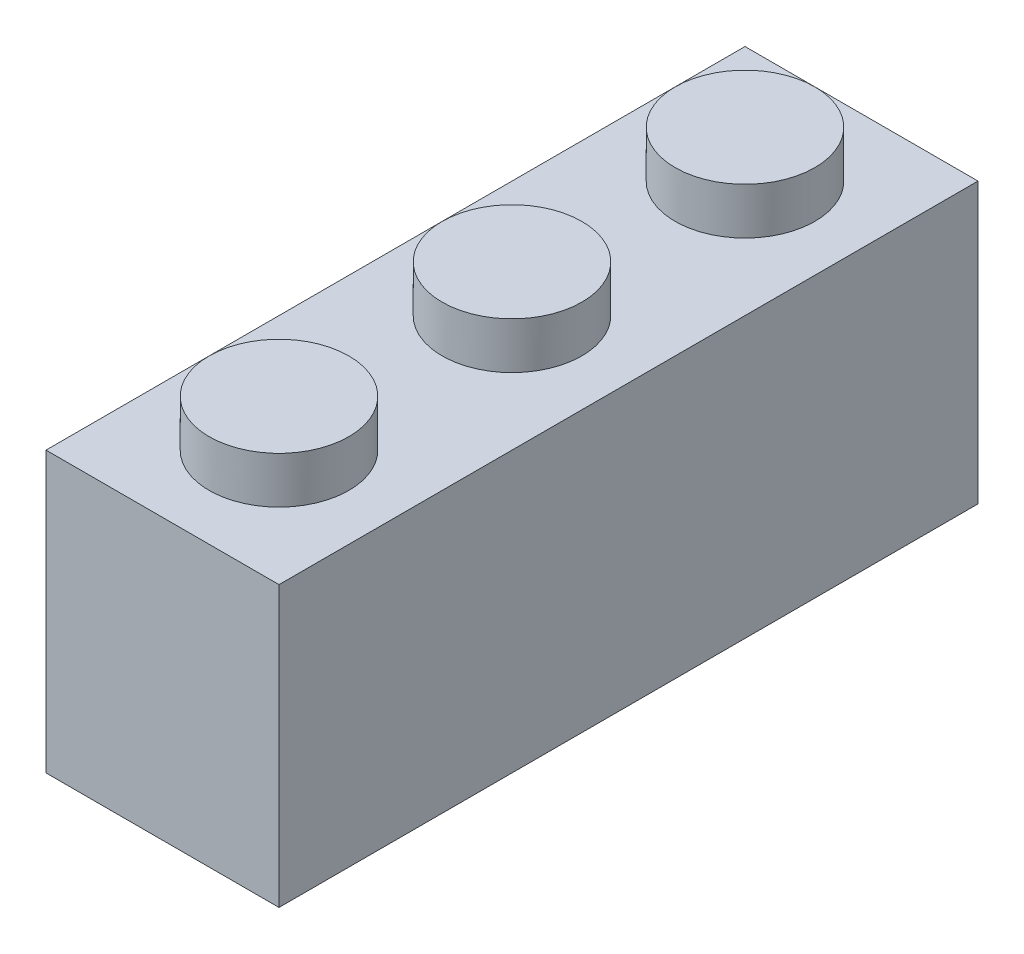
ISO-10303-21;
HEADER;
FILE_DESCRIPTION(('STEP AP214'),'2;1');
FILE_NAME('part.step','',(''),(''),'','','');
FILE_SCHEMA(('AUTOMOTIVE_DESIGN { 1 0 10303 214 1 1 1 1 }'));
ENDSEC;
DATA;
#1=APPLICATION_CONTEXT('core data for automotive mechanical design processes');
#2=APPLICATION_PROTOCOL_DEFINITION('international standard','automotive_design',2000,#1);
#3=PRODUCT_CONTEXT('',#1,'mechanical');
#4=PRODUCT('Part','Part','',(#3));
#5=PRODUCT_RELATED_PRODUCT_CATEGORY('part','',(#4));
#6=PRODUCT_DEFINITION_FORMATION('','',#4);
#7=PRODUCT_DEFINITION_CONTEXT('part definition',#1,'design');
#8=PRODUCT_DEFINITION('design','',#6,#7);
#9=PRODUCT_DEFINITION_SHAPE('','',#8);
#10=(LENGTH_UNIT() NAMED_UNIT(*) SI_UNIT(.MILLI.,.METRE.));
#11=(NAMED_UNIT(*) PLANE_ANGLE_UNIT() SI_UNIT($,.RADIAN.));
#12=(NAMED_UNIT(*) SI_UNIT($,.STERADIAN.) SOLID_ANGLE_UNIT());
#13=UNCERTAINTY_MEASURE_WITH_UNIT(LENGTH_MEASURE(1.E-05),#10,'distance_accuracy_value','');
#14=(GEOMETRIC_REPRESENTATION_CONTEXT(3) GLOBAL_UNCERTAINTY_ASSIGNED_CONTEXT((#13)) GLOBAL_UNIT_ASSIGNED_CONTEXT((#10,
#11,#12)) REPRESENTATION_CONTEXT('',''));
#15=CARTESIAN_POINT('',(0.,0.,0.));
#16=DIRECTION('',(0.,0.,1.));
#17=DIRECTION('',(1.,0.,0.));
#18=AXIS2_PLACEMENT_3D('',#15,#16,#17);
#19=CARTESIAN_POINT('',(0.,0.,0.));
#20=DIRECTION('',(0.,-1.,0.));
#21=DIRECTION('',(0.,0.,-1.));
#22=AXIS2_PLACEMENT_3D('',#19,#20,#21);
#23=PLANE('',#22);
#24=DIRECTION('',(0.,0.,1.));
#25=VECTOR('',#24,1.);
#26=CARTESIAN_POINT('',(0.,0.,0.));
#27=LINE('',#26,#25);
#28=CARTESIAN_POINT('',(0.,0.,-24.));
#29=VERTEX_POINT('',#28);
#30=CARTESIAN_POINT('',(0.,0.,0.));
#31=VERTEX_POINT('',#30);
#32=EDGE_CURVE('E182',#29,#31,#27,.T.);
#33=ORIENTED_EDGE('',*,*,#32,.F.);
#34=DIRECTION('',(-1.,0.,0.));
#35=VECTOR('',#34,1.);
#36=CARTESIAN_POINT('',(0.,0.,-24.));
#37=LINE('',#36,#35);
#38=CARTESIAN_POINT('',(8.,0.,-24.));
#39=VERTEX_POINT('',#38);
#40=EDGE_CURVE('E85',#39,#29,#37,.T.);
#41=ORIENTED_EDGE('',*,*,#40,.F.);
#42=DIRECTION('',(0.,0.,-1.));
#43=VECTOR('',#42,1.);
#44=CARTESIAN_POINT('',(8.,0.,0.));
#45=LINE('',#44,#43);
#46=CARTESIAN_POINT('',(8.,0.,0.));
#47=VERTEX_POINT('',#46);
#48=EDGE_CURVE('E200',#47,#39,#45,.T.);
#49=ORIENTED_EDGE('',*,*,#48,.F.);
#50=DIRECTION('',(1.,0.,0.));
#51=VECTOR('',#50,1.);
#52=CARTESIAN_POINT('',(0.,0.,0.));
#53=LINE('',#52,#51);
#54=EDGE_CURVE('E197',#31,#47,#53,.T.);
#55=ORIENTED_EDGE('',*,*,#54,.F.);
#56=EDGE_LOOP('',(#33,#41,#49,#55));
#57=FACE_BOUND('',#56,.T.);
#58=DIRECTION('',(-1.,0.,0.));
#59=VECTOR('',#58,1.);
#60=CARTESIAN_POINT('',(0.,0.,-22.4));
#61=LINE('',#60,#59);
#62=CARTESIAN_POINT('',(6.4,0.,-22.4));
#63=VERTEX_POINT('',#62);
#64=CARTESIAN_POINT('',(1.6,0.,-22.4));
#65=VERTEX_POINT('',#64);
#66=EDGE_CURVE('E165',#63,#65,#61,.T.);
#67=ORIENTED_EDGE('',*,*,#66,.T.);
#68=DIRECTION('',(0.,0.,1.));
#69=VECTOR('',#68,1.);
#70=CARTESIAN_POINT('',(1.6,0.,0.));
#71=LINE('',#70,#69);
#72=CARTESIAN_POINT('',(1.6,0.,-1.6));
#73=VERTEX_POINT('',#72);
#74=EDGE_CURVE('E156',#65,#73,#71,.T.);
#75=ORIENTED_EDGE('',*,*,#74,.T.);
#76=DIRECTION('',(1.,0.,0.));
#77=VECTOR('',#76,1.);
#78=CARTESIAN_POINT('',(0.,0.,-1.6));
#79=LINE('',#78,#77);
#80=CARTESIAN_POINT('',(6.4,0.,-1.6));
#81=VERTEX_POINT('',#80);
#82=EDGE_CURVE('E164',#73,#81,#79,.T.);
#83=ORIENTED_EDGE('',*,*,#82,.T.);
#84=DIRECTION('',(0.,0.,-1.));
#85=VECTOR('',#84,1.);
#86=CARTESIAN_POINT('',(6.4,0.,0.));
#87=LINE('',#86,#85);
#88=EDGE_CURVE('E55',#81,#63,#87,.T.);
#89=ORIENTED_EDGE('',*,*,#88,.T.);
#90=EDGE_LOOP('',(#67,#75,#83,#89));
#91=FACE_BOUND('',#90,.T.);
#92=ADVANCED_FACE('F39',(#57,#91),#23,.T.);
#93=CARTESIAN_POINT('',(4.,11.2,-20.));
#94=DIRECTION('',(0.,1.,0.));
#95=DIRECTION('',(0.,0.,1.));
#96=AXIS2_PLACEMENT_3D('',#93,#94,#95);
#97=PLANE('',#96);
#98=CARTESIAN_POINT('',(4.,11.2,-20.));
#99=DIRECTION('',(0.,1.,0.));
#100=DIRECTION('',(0.,0.,1.));
#101=AXIS2_PLACEMENT_3D('',#98,#99,#100);
#102=CIRCLE('',#101,2.4);
#103=CARTESIAN_POINT('',(4.,11.2,-17.6));
#104=VERTEX_POINT('',#103);
#105=EDGE_CURVE('E11',#104,#104,#102,.T.);
#106=ORIENTED_EDGE('',*,*,#105,.T.);
#107=EDGE_LOOP('',(#106));
#108=FACE_BOUND('',#107,.T.);
#109=ADVANCED_FACE('F41',(#108),#97,.T.);
#110=CARTESIAN_POINT('',(4.,11.2,-20.));
#111=DIRECTION('',(0.,-1.,0.));
#112=DIRECTION('',(0.,0.,-1.));
#113=AXIS2_PLACEMENT_3D('',#110,#111,#112);
#114=CYLINDRICAL_SURFACE('',#113,2.4);
#115=ORIENTED_EDGE('',*,*,#105,.F.);
#116=EDGE_LOOP('',(#115));
#117=FACE_BOUND('',#116,.T.);
#118=CARTESIAN_POINT('',(4.,9.6,-20.));
#119=DIRECTION('',(0.,-1.,0.));
#120=DIRECTION('',(0.,0.,-1.));
#121=AXIS2_PLACEMENT_3D('',#118,#119,#120);
#122=CIRCLE('',#121,2.4);
#123=CARTESIAN_POINT('',(4.,9.6,-22.4));
#124=VERTEX_POINT('',#123);
#125=EDGE_CURVE('E48',#124,#124,#122,.F.);
#126=ORIENTED_EDGE('',*,*,#125,.T.);
#127=EDGE_LOOP('',(#126));
#128=FACE_BOUND('',#127,.T.);
#129=ADVANCED_FACE('F228',(#117,#128),#114,.T.);
#130=CARTESIAN_POINT('',(0.,9.6,0.));
#131=DIRECTION('',(1.,0.,0.));
#132=DIRECTION('',(0.,0.,-1.));
#133=AXIS2_PLACEMENT_3D('',#130,#131,#132);
#134=PLANE('',#133);
#135=ORIENTED_EDGE('',*,*,#32,.T.);
#136=DIRECTION('',(0.,-1.,0.));
#137=VECTOR('',#136,1.);
#138=CARTESIAN_POINT('',(0.,9.6,0.));
#139=LINE('',#138,#137);
#140=CARTESIAN_POINT('',(0.,9.6,0.));
#141=VERTEX_POINT('',#140);
#142=EDGE_CURVE('E214',#141,#31,#139,.T.);
#143=ORIENTED_EDGE('',*,*,#142,.F.);
#144=DIRECTION('',(0.,0.,1.));
#145=VECTOR('',#144,1.);
#146=CARTESIAN_POINT('',(0.,9.6,0.));
#147=LINE('',#146,#145);
#148=CARTESIAN_POINT('',(0.,9.6,-24.));
#149=VERTEX_POINT('',#148);
#150=EDGE_CURVE('E183',#149,#141,#147,.T.);
#151=ORIENTED_EDGE('',*,*,#150,.F.);
#152=DIRECTION('',(0.,-1.,0.));
#153=VECTOR('',#152,1.);
#154=CARTESIAN_POINT('',(0.,9.6,-24.));
#155=LINE('',#154,#153);
#156=EDGE_CURVE('E193',#149,#29,#155,.T.);
#157=ORIENTED_EDGE('',*,*,#156,.T.);
#158=EDGE_LOOP('',(#135,#143,#151,#157));
#159=FACE_BOUND('',#158,.T.);
#160=ADVANCED_FACE('F263',(#159),#134,.F.);
#161=CARTESIAN_POINT('',(0.,9.6,0.));
#162=DIRECTION('',(0.,0.,-1.));
#163=DIRECTION('',(-1.,0.,0.));
#164=AXIS2_PLACEMENT_3D('',#161,#162,#163);
#165=PLANE('',#164);
#166=ORIENTED_EDGE('',*,*,#54,.T.);
#167=DIRECTION('',(0.,-1.,0.));
#168=VECTOR('',#167,1.);
#169=CARTESIAN_POINT('',(8.,9.6,0.));
#170=LINE('',#169,#168);
#171=CARTESIAN_POINT('',(8.,9.6,0.));
#172=VERTEX_POINT('',#171);
#173=EDGE_CURVE('E210',#172,#47,#170,.T.);
#174=ORIENTED_EDGE('',*,*,#173,.F.);
#175=DIRECTION('',(1.,0.,0.));
#176=VECTOR('',#175,1.);
#177=CARTESIAN_POINT('',(0.,9.6,0.));
#178=LINE('',#177,#176);
#179=EDGE_CURVE('E93',#141,#172,#178,.T.);
#180=ORIENTED_EDGE('',*,*,#179,.F.);
#181=ORIENTED_EDGE('',*,*,#142,.T.);
#182=EDGE_LOOP('',(#166,#174,#180,#181));
#183=FACE_BOUND('',#182,.T.);
#184=ADVANCED_FACE('F259',(#183),#165,.F.);
#185=CARTESIAN_POINT('',(8.,9.6,0.));
#186=DIRECTION('',(-1.,0.,0.));
#187=DIRECTION('',(0.,0.,1.));
#188=AXIS2_PLACEMENT_3D('',#185,#186,#187);
#189=PLANE('',#188);
#190=ORIENTED_EDGE('',*,*,#48,.T.);
#191=DIRECTION('',(0.,-1.,0.));
#192=VECTOR('',#191,1.);
#193=CARTESIAN_POINT('',(8.,9.6,-24.));
#194=LINE('',#193,#192);
#195=CARTESIAN_POINT('',(8.,9.6,-24.));
#196=VERTEX_POINT('',#195);
#197=EDGE_CURVE('E207',#196,#39,#194,.T.);
#198=ORIENTED_EDGE('',*,*,#197,.F.);
#199=DIRECTION('',(0.,0.,-1.));
#200=VECTOR('',#199,1.);
#201=CARTESIAN_POINT('',(8.,9.6,0.));
#202=LINE('',#201,#200);
#203=EDGE_CURVE('E188',#172,#196,#202,.T.);
#204=ORIENTED_EDGE('',*,*,#203,.F.);
#205=ORIENTED_EDGE('',*,*,#173,.T.);
#206=EDGE_LOOP('',(#190,#198,#204,#205));
#207=FACE_BOUND('',#206,.T.);
#208=ADVANCED_FACE('F243',(#207),#189,.F.);
#209=CARTESIAN_POINT('',(0.,9.6,-24.));
#210=DIRECTION('',(0.,0.,1.));
#211=DIRECTION('',(1.,0.,0.));
#212=AXIS2_PLACEMENT_3D('',#209,#210,#211);
#213=PLANE('',#212);
#214=ORIENTED_EDGE('',*,*,#40,.T.);
#215=ORIENTED_EDGE('',*,*,#156,.F.);
#216=DIRECTION('',(-1.,0.,0.));
#217=VECTOR('',#216,1.);
#218=CARTESIAN_POINT('',(0.,9.6,-24.));
#219=LINE('',#218,#217);
#220=EDGE_CURVE('E64',#196,#149,#219,.T.);
#221=ORIENTED_EDGE('',*,*,#220,.F.);
#222=ORIENTED_EDGE('',*,*,#197,.T.);
#223=EDGE_LOOP('',(#214,#215,#221,#222));
#224=FACE_BOUND('',#223,.T.);
#225=ADVANCED_FACE('F233',(#224),#213,.F.);
#226=CARTESIAN_POINT('',(0.,9.6,0.));
#227=DIRECTION('',(0.,-1.,0.));
#228=DIRECTION('',(0.,0.,-1.));
#229=AXIS2_PLACEMENT_3D('',#226,#227,#228);
#230=PLANE('',#229);
#231=CARTESIAN_POINT('',(4.,9.6,-12.));
#232=DIRECTION('',(0.,-1.,0.));
#233=DIRECTION('',(0.,0.,-1.));
#234=AXIS2_PLACEMENT_3D('',#231,#232,#233);
#235=CIRCLE('',#234,2.4);
#236=CARTESIAN_POINT('',(4.,9.6,-14.4));
#237=VERTEX_POINT('',#236);
#238=EDGE_CURVE('E221',#237,#237,#235,.F.);
#239=ORIENTED_EDGE('',*,*,#238,.F.);
#240=EDGE_LOOP('',(#239));
#241=FACE_BOUND('',#240,.T.);
#242=CARTESIAN_POINT('',(4.,9.6,-4.));
#243=DIRECTION('',(0.,-1.,0.));
#244=DIRECTION('',(0.,0.,-1.));
#245=AXIS2_PLACEMENT_3D('',#242,#243,#244);
#246=CIRCLE('',#245,2.4);
#247=CARTESIAN_POINT('',(4.,9.6,-6.4));
#248=VERTEX_POINT('',#247);
#249=EDGE_CURVE('E217',#248,#248,#246,.F.);
#250=ORIENTED_EDGE('',*,*,#249,.F.);
#251=EDGE_LOOP('',(#250));
#252=FACE_BOUND('',#251,.T.);
#253=ORIENTED_EDGE('',*,*,#150,.T.);
#254=ORIENTED_EDGE('',*,*,#179,.T.);
#255=ORIENTED_EDGE('',*,*,#203,.T.);
#256=ORIENTED_EDGE('',*,*,#220,.T.);
#257=EDGE_LOOP('',(#253,#254,#255,#256));
#258=FACE_BOUND('',#257,.T.);
#259=ORIENTED_EDGE('',*,*,#125,.F.);
#260=EDGE_LOOP('',(#259));
#261=FACE_BOUND('',#260,.T.);
#262=ADVANCED_FACE('F230',(#241,#252,#258,#261),#230,.F.);
#263=CARTESIAN_POINT('',(4.,11.2,-4.));
#264=DIRECTION('',(0.,-1.,0.));
#265=DIRECTION('',(0.,0.,-1.));
#266=AXIS2_PLACEMENT_3D('',#263,#264,#265);
#267=CYLINDRICAL_SURFACE('',#266,2.4);
#268=CARTESIAN_POINT('',(4.,11.2,-4.));
#269=DIRECTION('',(0.,1.,0.));
#270=DIRECTION('',(0.,0.,1.));
#271=AXIS2_PLACEMENT_3D('',#268,#269,#270);
#272=CIRCLE('',#271,2.4);
#273=CARTESIAN_POINT('',(4.,11.2,-1.6));
#274=VERTEX_POINT('',#273);
#275=EDGE_CURVE('E177',#274,#274,#272,.T.);
#276=ORIENTED_EDGE('',*,*,#275,.F.);
#277=EDGE_LOOP('',(#276));
#278=FACE_BOUND('',#277,.T.);
#279=ORIENTED_EDGE('',*,*,#249,.T.);
#280=EDGE_LOOP('',(#279));
#281=FACE_BOUND('',#280,.T.);
#282=ADVANCED_FACE('F232',(#278,#281),#267,.T.);
#283=CARTESIAN_POINT('',(4.,11.2,-4.));
#284=DIRECTION('',(0.,1.,0.));
#285=DIRECTION('',(0.,0.,1.));
#286=AXIS2_PLACEMENT_3D('',#283,#284,#285);
#287=PLANE('',#286);
#288=ORIENTED_EDGE('',*,*,#275,.T.);
#289=EDGE_LOOP('',(#288));
#290=FACE_BOUND('',#289,.T.);
#291=ADVANCED_FACE('F240',(#290),#287,.T.);
#292=CARTESIAN_POINT('',(4.,11.2,-12.));
#293=DIRECTION('',(0.,-1.,0.));
#294=DIRECTION('',(0.,0.,-1.));
#295=AXIS2_PLACEMENT_3D('',#292,#293,#294);
#296=CYLINDRICAL_SURFACE('',#295,2.4);
#297=CARTESIAN_POINT('',(4.,11.2,-12.));
#298=DIRECTION('',(0.,1.,0.));
#299=DIRECTION('',(0.,0.,1.));
#300=AXIS2_PLACEMENT_3D('',#297,#298,#299);
#301=CIRCLE('',#300,2.4);
#302=CARTESIAN_POINT('',(4.,11.2,-9.6));
#303=VERTEX_POINT('',#302);
#304=EDGE_CURVE('E173',#303,#303,#301,.T.);
#305=ORIENTED_EDGE('',*,*,#304,.F.);
#306=EDGE_LOOP('',(#305));
#307=FACE_BOUND('',#306,.T.);
#308=ORIENTED_EDGE('',*,*,#238,.T.);
#309=EDGE_LOOP('',(#308));
#310=FACE_BOUND('',#309,.T.);
#311=ADVANCED_FACE('F304',(#307,#310),#296,.T.);
#312=CARTESIAN_POINT('',(4.,11.2,-12.));
#313=DIRECTION('',(0.,1.,0.));
#314=DIRECTION('',(0.,0.,1.));
#315=AXIS2_PLACEMENT_3D('',#312,#313,#314);
#316=PLANE('',#315);
#317=ORIENTED_EDGE('',*,*,#304,.T.);
#318=EDGE_LOOP('',(#317));
#319=FACE_BOUND('',#318,.T.);
#320=ADVANCED_FACE('F322',(#319),#316,.T.);
#321=CARTESIAN_POINT('',(4.,9.6,-20.));
#322=DIRECTION('',(0.,1.,0.));
#323=DIRECTION('',(0.,0.,1.));
#324=AXIS2_PLACEMENT_3D('',#321,#322,#323);
#325=PLANE('',#324);
#326=CARTESIAN_POINT('',(4.,9.6,-20.));
#327=DIRECTION('',(0.,1.,0.));
#328=DIRECTION('',(0.,0.,1.));
#329=AXIS2_PLACEMENT_3D('',#326,#327,#328);
#330=CIRCLE('',#329,0.799999999999999);
#331=CARTESIAN_POINT('',(4.,9.6,-19.2));
#332=VERTEX_POINT('',#331);
#333=EDGE_CURVE('E178',#332,#332,#330,.T.);
#334=ORIENTED_EDGE('',*,*,#333,.F.);
#335=EDGE_LOOP('',(#334));
#336=FACE_BOUND('',#335,.T.);
#337=ADVANCED_FACE('F331',(#336),#325,.F.);
#338=CARTESIAN_POINT('',(4.,11.2,-20.));
#339=DIRECTION('',(0.,-1.,0.));
#340=DIRECTION('',(0.,0.,-1.));
#341=AXIS2_PLACEMENT_3D('',#338,#339,#340);
#342=CYLINDRICAL_SURFACE('',#341,0.799999999999999);
#343=ORIENTED_EDGE('',*,*,#333,.T.);
#344=EDGE_LOOP('',(#343));
#345=FACE_BOUND('',#344,.T.);
#346=CARTESIAN_POINT('',(4.,8.,-20.));
#347=DIRECTION('',(0.,-1.,0.));
#348=DIRECTION('',(0.,0.,-1.));
#349=AXIS2_PLACEMENT_3D('',#346,#347,#348);
#350=CIRCLE('',#349,0.799999999999999);
#351=CARTESIAN_POINT('',(4.,8.,-20.8));
#352=VERTEX_POINT('',#351);
#353=EDGE_CURVE('E450',#352,#352,#350,.F.);
#354=ORIENTED_EDGE('',*,*,#353,.F.);
#355=EDGE_LOOP('',(#354));
#356=FACE_BOUND('',#355,.T.);
#357=ADVANCED_FACE('F344',(#345,#356),#342,.F.);
#358=CARTESIAN_POINT('',(1.6,9.6,0.));
#359=DIRECTION('',(1.,0.,0.));
#360=DIRECTION('',(0.,0.,-1.));
#361=AXIS2_PLACEMENT_3D('',#358,#359,#360);
#362=PLANE('',#361);
#363=ORIENTED_EDGE('',*,*,#74,.F.);
#364=DIRECTION('',(0.,-1.,0.));
#365=VECTOR('',#364,1.);
#366=CARTESIAN_POINT('',(1.6,9.6,-22.4));
#367=LINE('',#366,#365);
#368=CARTESIAN_POINT('',(1.6,8.,-22.4));
#369=VERTEX_POINT('',#368);
#370=EDGE_CURVE('E141',#369,#65,#367,.T.);
#371=ORIENTED_EDGE('',*,*,#370,.F.);
#372=DIRECTION('',(0.,0.,1.));
#373=VECTOR('',#372,1.);
#374=CARTESIAN_POINT('',(1.6,8.,0.));
#375=LINE('',#374,#373);
#376=CARTESIAN_POINT('',(1.6,8.,-1.6));
#377=VERTEX_POINT('',#376);
#378=EDGE_CURVE('E127',#369,#377,#375,.T.);
#379=ORIENTED_EDGE('',*,*,#378,.T.);
#380=DIRECTION('',(0.,-1.,0.));
#381=VECTOR('',#380,1.);
#382=CARTESIAN_POINT('',(1.6,9.6,-1.6));
#383=LINE('',#382,#381);
#384=EDGE_CURVE('E120',#377,#73,#383,.T.);
#385=ORIENTED_EDGE('',*,*,#384,.T.);
#386=EDGE_LOOP('',(#363,#371,#379,#385));
#387=FACE_BOUND('',#386,.T.);
#388=ADVANCED_FACE('F353',(#387),#362,.T.);
#389=CARTESIAN_POINT('',(0.,9.6,-1.6));
#390=DIRECTION('',(0.,0.,-1.));
#391=DIRECTION('',(-1.,0.,0.));
#392=AXIS2_PLACEMENT_3D('',#389,#390,#391);
#393=PLANE('',#392);
#394=ORIENTED_EDGE('',*,*,#82,.F.);
#395=ORIENTED_EDGE('',*,*,#384,.F.);
#396=DIRECTION('',(1.,0.,0.));
#397=VECTOR('',#396,1.);
#398=CARTESIAN_POINT('',(0.,8.,-1.6));
#399=LINE('',#398,#397);
#400=CARTESIAN_POINT('',(6.4,8.,-1.6));
#401=VERTEX_POINT('',#400);
#402=EDGE_CURVE('E115',#377,#401,#399,.T.);
#403=ORIENTED_EDGE('',*,*,#402,.T.);
#404=DIRECTION('',(0.,-1.,0.));
#405=VECTOR('',#404,1.);
#406=CARTESIAN_POINT('',(6.4,9.6,-1.6));
#407=LINE('',#406,#405);
#408=EDGE_CURVE('E117',#401,#81,#407,.T.);
#409=ORIENTED_EDGE('',*,*,#408,.T.);
#410=EDGE_LOOP('',(#394,#395,#403,#409));
#411=FACE_BOUND('',#410,.T.);
#412=ADVANCED_FACE('F116',(#411),#393,.T.);
#413=CARTESIAN_POINT('',(6.4,9.6,0.));
#414=DIRECTION('',(-1.,0.,0.));
#415=DIRECTION('',(0.,0.,1.));
#416=AXIS2_PLACEMENT_3D('',#413,#414,#415);
#417=PLANE('',#416);
#418=ORIENTED_EDGE('',*,*,#88,.F.);
#419=ORIENTED_EDGE('',*,*,#408,.F.);
#420=DIRECTION('',(0.,0.,-1.));
#421=VECTOR('',#420,1.);
#422=CARTESIAN_POINT('',(6.4,8.,0.));
#423=LINE('',#422,#421);
#424=CARTESIAN_POINT('',(6.4,8.,-22.4));
#425=VERTEX_POINT('',#424);
#426=EDGE_CURVE('E126',#401,#425,#423,.T.);
#427=ORIENTED_EDGE('',*,*,#426,.T.);
#428=DIRECTION('',(0.,-1.,0.));
#429=VECTOR('',#428,1.);
#430=CARTESIAN_POINT('',(6.4,9.6,-22.4));
#431=LINE('',#430,#429);
#432=EDGE_CURVE('E132',#425,#63,#431,.T.);
#433=ORIENTED_EDGE('',*,*,#432,.T.);
#434=EDGE_LOOP('',(#418,#419,#427,#433));
#435=FACE_BOUND('',#434,.T.);
#436=ADVANCED_FACE('F129',(#435),#417,.T.);
#437=CARTESIAN_POINT('',(0.,9.6,-22.4));
#438=DIRECTION('',(0.,0.,1.));
#439=DIRECTION('',(1.,0.,0.));
#440=AXIS2_PLACEMENT_3D('',#437,#438,#439);
#441=PLANE('',#440);
#442=ORIENTED_EDGE('',*,*,#66,.F.);
#443=ORIENTED_EDGE('',*,*,#432,.F.);
#444=DIRECTION('',(-1.,0.,0.));
#445=VECTOR('',#444,1.);
#446=CARTESIAN_POINT('',(0.,8.,-22.4));
#447=LINE('',#446,#445);
#448=EDGE_CURVE('E137',#425,#369,#447,.T.);
#449=ORIENTED_EDGE('',*,*,#448,.T.);
#450=ORIENTED_EDGE('',*,*,#370,.T.);
#451=EDGE_LOOP('',(#442,#443,#449,#450));
#452=FACE_BOUND('',#451,.T.);
#453=ADVANCED_FACE('F377',(#452),#441,.T.);
#454=CARTESIAN_POINT('',(0.,8.,0.));
#455=DIRECTION('',(0.,-1.,0.));
#456=DIRECTION('',(0.,0.,-1.));
#457=AXIS2_PLACEMENT_3D('',#454,#455,#456);
#458=PLANE('',#457);
#459=CARTESIAN_POINT('',(4.,8.,-12.));
#460=DIRECTION('',(0.,-1.,0.));
#461=DIRECTION('',(0.,0.,-1.));
#462=AXIS2_PLACEMENT_3D('',#459,#460,#461);
#463=CIRCLE('',#462,0.799999999999999);
#464=CARTESIAN_POINT('',(4.,8.,-12.8));
#465=VERTEX_POINT('',#464);
#466=EDGE_CURVE('E448',#465,#465,#463,.F.);
#467=ORIENTED_EDGE('',*,*,#466,.T.);
#468=EDGE_LOOP('',(#467));
#469=FACE_BOUND('',#468,.T.);
#470=CARTESIAN_POINT('',(4.,8.,-4.));
#471=DIRECTION('',(0.,-1.,0.));
#472=DIRECTION('',(0.,0.,-1.));
#473=AXIS2_PLACEMENT_3D('',#470,#471,#472);
#474=CIRCLE('',#473,0.799999999999999);
#475=CARTESIAN_POINT('',(4.,8.,-4.8));
#476=VERTEX_POINT('',#475);
#477=EDGE_CURVE('E147',#476,#476,#474,.F.);
#478=ORIENTED_EDGE('',*,*,#477,.T.);
#479=EDGE_LOOP('',(#478));
#480=FACE_BOUND('',#479,.T.);
#481=ORIENTED_EDGE('',*,*,#378,.F.);
#482=ORIENTED_EDGE('',*,*,#448,.F.);
#483=ORIENTED_EDGE('',*,*,#426,.F.);
#484=ORIENTED_EDGE('',*,*,#402,.F.);
#485=EDGE_LOOP('',(#481,#482,#483,#484));
#486=FACE_BOUND('',#485,.T.);
#487=ORIENTED_EDGE('',*,*,#353,.T.);
#488=EDGE_LOOP('',(#487));
#489=FACE_BOUND('',#488,.T.);
#490=ADVANCED_FACE('F135',(#469,#480,#486,#489),#458,.T.);
#491=CARTESIAN_POINT('',(4.,11.2,-4.));
#492=DIRECTION('',(0.,-1.,0.));
#493=DIRECTION('',(0.,0.,-1.));
#494=AXIS2_PLACEMENT_3D('',#491,#492,#493);
#495=CYLINDRICAL_SURFACE('',#494,0.799999999999999);
#496=CARTESIAN_POINT('',(4.,9.6,-4.));
#497=DIRECTION('',(0.,1.,0.));
#498=DIRECTION('',(0.,0.,1.));
#499=AXIS2_PLACEMENT_3D('',#496,#497,#498);
#500=CIRCLE('',#499,0.799999999999999);
#501=CARTESIAN_POINT('',(4.,9.6,-3.2));
#502=VERTEX_POINT('',#501);
#503=EDGE_CURVE('E152',#502,#502,#500,.T.);
#504=ORIENTED_EDGE('',*,*,#503,.T.);
#505=EDGE_LOOP('',(#504));
#506=FACE_BOUND('',#505,.T.);
#507=ORIENTED_EDGE('',*,*,#477,.F.);
#508=EDGE_LOOP('',(#507));
#509=FACE_BOUND('',#508,.T.);
#510=ADVANCED_FACE('F393',(#506,#509),#495,.F.);
#511=CARTESIAN_POINT('',(4.,9.6,-4.));
#512=DIRECTION('',(0.,1.,0.));
#513=DIRECTION('',(0.,0.,1.));
#514=AXIS2_PLACEMENT_3D('',#511,#512,#513);
#515=PLANE('',#514);
#516=ORIENTED_EDGE('',*,*,#503,.F.);
#517=EDGE_LOOP('',(#516));
#518=FACE_BOUND('',#517,.T.);
#519=ADVANCED_FACE('F402',(#518),#515,.F.);
#520=CARTESIAN_POINT('',(4.,11.2,-12.));
#521=DIRECTION('',(0.,-1.,0.));
#522=DIRECTION('',(0.,0.,-1.));
#523=AXIS2_PLACEMENT_3D('',#520,#521,#522);
#524=CYLINDRICAL_SURFACE('',#523,0.799999999999999);
#525=CARTESIAN_POINT('',(4.,9.6,-12.));
#526=DIRECTION('',(0.,1.,0.));
#527=DIRECTION('',(0.,0.,1.));
#528=AXIS2_PLACEMENT_3D('',#525,#526,#527);
#529=CIRCLE('',#528,0.799999999999999);
#530=CARTESIAN_POINT('',(4.,9.6,-11.2));
#531=VERTEX_POINT('',#530);
#532=EDGE_CURVE('E157',#531,#531,#529,.T.);
#533=ORIENTED_EDGE('',*,*,#532,.T.);
#534=EDGE_LOOP('',(#533));
#535=FACE_BOUND('',#534,.T.);
#536=ORIENTED_EDGE('',*,*,#466,.F.);
#537=EDGE_LOOP('',(#536));
#538=FACE_BOUND('',#537,.T.);
#539=ADVANCED_FACE('F411',(#535,#538),#524,.F.);
#540=CARTESIAN_POINT('',(4.,9.6,-12.));
#541=DIRECTION('',(0.,1.,0.));
#542=DIRECTION('',(0.,0.,1.));
#543=AXIS2_PLACEMENT_3D('',#540,#541,#542);
#544=PLANE('',#543);
#545=ORIENTED_EDGE('',*,*,#532,.F.);
#546=EDGE_LOOP('',(#545));
#547=FACE_BOUND('',#546,.T.);
#548=ADVANCED_FACE('F420',(#547),#544,.F.);
#549=CLOSED_SHELL('',(#92,#109,#129,#160,#184,#208,#225,#262,#282,#291,#311,#320,#337,#357,#388,
#412,#436,#453,#490,#510,#519,#539,#548));
#550=MANIFOLD_SOLID_BREP('B2',#549);
#551=ADVANCED_BREP_SHAPE_REPRESENTATION('',(#18,#550),#14);
#552=SHAPE_DEFINITION_REPRESENTATION(#9,#551);
ENDSEC;
END-ISO-10303-21;
